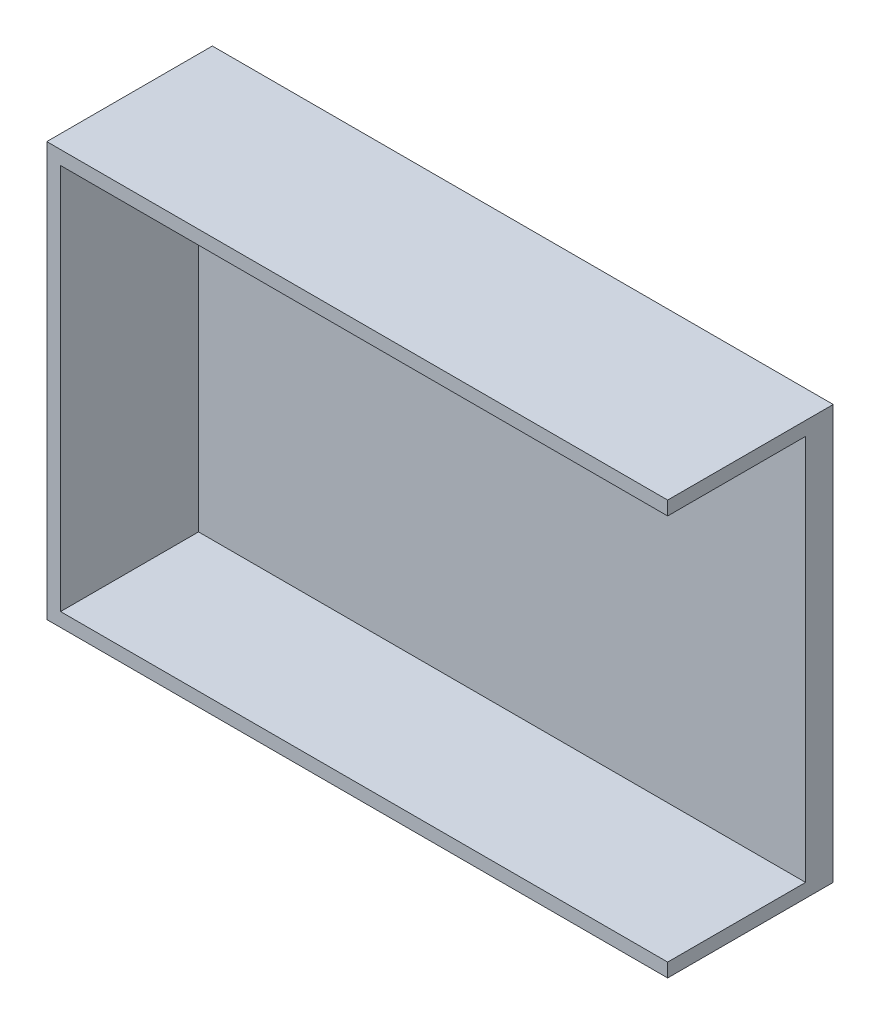
ISO-10303-21;
HEADER;
FILE_DESCRIPTION(('STEP AP214'),'2;1');
FILE_NAME('part.step','',(''),(''),'','','');
FILE_SCHEMA(('AUTOMOTIVE_DESIGN { 1 0 10303 214 1 1 1 1 }'));
ENDSEC;
DATA;
#1=APPLICATION_CONTEXT('core data for automotive mechanical design processes');
#2=APPLICATION_PROTOCOL_DEFINITION('international standard','automotive_design',2000,#1);
#3=PRODUCT_CONTEXT('',#1,'mechanical');
#4=PRODUCT('Part','Part','',(#3));
#5=PRODUCT_RELATED_PRODUCT_CATEGORY('part','',(#4));
#6=PRODUCT_DEFINITION_FORMATION('','',#4);
#7=PRODUCT_DEFINITION_CONTEXT('part definition',#1,'design');
#8=PRODUCT_DEFINITION('design','',#6,#7);
#9=PRODUCT_DEFINITION_SHAPE('','',#8);
#10=(LENGTH_UNIT() NAMED_UNIT(*) SI_UNIT(.MILLI.,.METRE.));
#11=(NAMED_UNIT(*) PLANE_ANGLE_UNIT() SI_UNIT($,.RADIAN.));
#12=(NAMED_UNIT(*) SI_UNIT($,.STERADIAN.) SOLID_ANGLE_UNIT());
#13=UNCERTAINTY_MEASURE_WITH_UNIT(LENGTH_MEASURE(1.E-05),#10,'distance_accuracy_value','');
#14=(GEOMETRIC_REPRESENTATION_CONTEXT(3) GLOBAL_UNCERTAINTY_ASSIGNED_CONTEXT((#13)) GLOBAL_UNIT_ASSIGNED_CONTEXT((#10,
#11,#12)) REPRESENTATION_CONTEXT('',''));
#15=CARTESIAN_POINT('',(0.,0.,0.));
#16=DIRECTION('',(0.,0.,1.));
#17=DIRECTION('',(1.,0.,0.));
#18=AXIS2_PLACEMENT_3D('',#15,#16,#17);
#19=CARTESIAN_POINT('',(0.,0.,12.));
#20=DIRECTION('',(1.,0.,0.));
#21=DIRECTION('',(0.,0.,-1.));
#22=AXIS2_PLACEMENT_3D('',#19,#20,#21);
#23=PLANE('',#22);
#24=DIRECTION('',(0.,-1.,0.));
#25=VECTOR('',#24,1.);
#26=CARTESIAN_POINT('',(0.,0.,0.));
#27=LINE('',#26,#25);
#28=CARTESIAN_POINT('',(0.,30.,0.));
#29=VERTEX_POINT('',#28);
#30=CARTESIAN_POINT('',(0.,0.,0.));
#31=VERTEX_POINT('',#30);
#32=EDGE_CURVE('E136',#29,#31,#27,.T.);
#33=ORIENTED_EDGE('',*,*,#32,.T.);
#34=DIRECTION('',(0.,0.,-1.));
#35=VECTOR('',#34,1.);
#36=CARTESIAN_POINT('',(0.,0.,12.));
#37=LINE('',#36,#35);
#38=CARTESIAN_POINT('',(0.,0.,12.));
#39=VERTEX_POINT('',#38);
#40=EDGE_CURVE('E11',#39,#31,#37,.T.);
#41=ORIENTED_EDGE('',*,*,#40,.F.);
#42=DIRECTION('',(0.,-1.,0.));
#43=VECTOR('',#42,1.);
#44=CARTESIAN_POINT('',(0.,0.,12.));
#45=LINE('',#44,#43);
#46=CARTESIAN_POINT('',(0.,30.,12.));
#47=VERTEX_POINT('',#46);
#48=EDGE_CURVE('E140',#47,#39,#45,.T.);
#49=ORIENTED_EDGE('',*,*,#48,.F.);
#50=DIRECTION('',(0.,0.,-1.));
#51=VECTOR('',#50,1.);
#52=CARTESIAN_POINT('',(0.,30.,12.));
#53=LINE('',#52,#51);
#54=EDGE_CURVE('E148',#47,#29,#53,.T.);
#55=ORIENTED_EDGE('',*,*,#54,.T.);
#56=EDGE_LOOP('',(#33,#41,#49,#55));
#57=FACE_BOUND('',#56,.T.);
#58=ADVANCED_FACE('F32',(#57),#23,.F.);
#59=CARTESIAN_POINT('',(0.,0.,12.));
#60=DIRECTION('',(0.,1.,0.));
#61=DIRECTION('',(0.,0.,1.));
#62=AXIS2_PLACEMENT_3D('',#59,#60,#61);
#63=PLANE('',#62);
#64=DIRECTION('',(1.,0.,0.));
#65=VECTOR('',#64,1.);
#66=CARTESIAN_POINT('',(0.,0.,0.));
#67=LINE('',#66,#65);
#68=CARTESIAN_POINT('',(45.,0.,0.));
#69=VERTEX_POINT('',#68);
#70=EDGE_CURVE('E151',#31,#69,#67,.T.);
#71=ORIENTED_EDGE('',*,*,#70,.T.);
#72=DIRECTION('',(0.,0.,-1.));
#73=VECTOR('',#72,1.);
#74=CARTESIAN_POINT('',(45.,0.,12.));
#75=LINE('',#74,#73);
#76=CARTESIAN_POINT('',(45.,0.,12.));
#77=VERTEX_POINT('',#76);
#78=EDGE_CURVE('E39',#77,#69,#75,.T.);
#79=ORIENTED_EDGE('',*,*,#78,.F.);
#80=DIRECTION('',(1.,0.,0.));
#81=VECTOR('',#80,1.);
#82=CARTESIAN_POINT('',(0.,0.,12.));
#83=LINE('',#82,#81);
#84=EDGE_CURVE('E83',#39,#77,#83,.T.);
#85=ORIENTED_EDGE('',*,*,#84,.F.);
#86=ORIENTED_EDGE('',*,*,#40,.T.);
#87=EDGE_LOOP('',(#71,#79,#85,#86));
#88=FACE_BOUND('',#87,.T.);
#89=ADVANCED_FACE('F187',(#88),#63,.F.);
#90=CARTESIAN_POINT('',(45.,0.,12.));
#91=DIRECTION('',(-1.,0.,0.));
#92=DIRECTION('',(0.,0.,1.));
#93=AXIS2_PLACEMENT_3D('',#90,#91,#92);
#94=PLANE('',#93);
#95=DIRECTION('',(0.,1.,0.));
#96=VECTOR('',#95,1.);
#97=CARTESIAN_POINT('',(45.,0.,12.));
#98=LINE('',#97,#96);
#99=CARTESIAN_POINT('',(45.,29.,12.));
#100=VERTEX_POINT('',#99);
#101=CARTESIAN_POINT('',(45.,30.,12.));
#102=VERTEX_POINT('',#101);
#103=EDGE_CURVE('E143',#100,#102,#98,.T.);
#104=ORIENTED_EDGE('',*,*,#103,.F.);
#105=DIRECTION('',(0.,0.,1.));
#106=VECTOR('',#105,1.);
#107=CARTESIAN_POINT('',(45.,29.,2.));
#108=LINE('',#107,#106);
#109=CARTESIAN_POINT('',(45.,29.,2.));
#110=VERTEX_POINT('',#109);
#111=EDGE_CURVE('E137',#110,#100,#108,.T.);
#112=ORIENTED_EDGE('',*,*,#111,.F.);
#113=DIRECTION('',(0.,1.,0.));
#114=VECTOR('',#113,1.);
#115=CARTESIAN_POINT('',(45.,29.,2.));
#116=LINE('',#115,#114);
#117=CARTESIAN_POINT('',(45.,1.,2.));
#118=VERTEX_POINT('',#117);
#119=EDGE_CURVE('E120',#118,#110,#116,.T.);
#120=ORIENTED_EDGE('',*,*,#119,.F.);
#121=DIRECTION('',(0.,0.,1.));
#122=VECTOR('',#121,1.);
#123=CARTESIAN_POINT('',(45.,1.,2.));
#124=LINE('',#123,#122);
#125=CARTESIAN_POINT('',(45.,1.,12.));
#126=VERTEX_POINT('',#125);
#127=EDGE_CURVE('E111',#118,#126,#124,.T.);
#128=ORIENTED_EDGE('',*,*,#127,.T.);
#129=EDGE_CURVE('E144',#77,#126,#98,.T.);
#130=ORIENTED_EDGE('',*,*,#129,.F.);
#131=ORIENTED_EDGE('',*,*,#78,.T.);
#132=DIRECTION('',(0.,1.,0.));
#133=VECTOR('',#132,1.);
#134=CARTESIAN_POINT('',(45.,0.,0.));
#135=LINE('',#134,#133);
#136=CARTESIAN_POINT('',(45.,30.,0.));
#137=VERTEX_POINT('',#136);
#138=EDGE_CURVE('E153',#69,#137,#135,.T.);
#139=ORIENTED_EDGE('',*,*,#138,.T.);
#140=DIRECTION('',(0.,0.,-1.));
#141=VECTOR('',#140,1.);
#142=CARTESIAN_POINT('',(45.,30.,12.));
#143=LINE('',#142,#141);
#144=EDGE_CURVE('E157',#102,#137,#143,.T.);
#145=ORIENTED_EDGE('',*,*,#144,.F.);
#146=EDGE_LOOP('',(#104,#112,#120,#128,#130,#131,#139,#145));
#147=FACE_BOUND('',#146,.T.);
#148=ADVANCED_FACE('F163',(#147),#94,.F.);
#149=CARTESIAN_POINT('',(0.,30.,12.));
#150=DIRECTION('',(0.,-1.,0.));
#151=DIRECTION('',(0.,0.,-1.));
#152=AXIS2_PLACEMENT_3D('',#149,#150,#151);
#153=PLANE('',#152);
#154=DIRECTION('',(-1.,0.,0.));
#155=VECTOR('',#154,1.);
#156=CARTESIAN_POINT('',(0.,30.,0.));
#157=LINE('',#156,#155);
#158=EDGE_CURVE('E76',#137,#29,#157,.T.);
#159=ORIENTED_EDGE('',*,*,#158,.T.);
#160=ORIENTED_EDGE('',*,*,#54,.F.);
#161=DIRECTION('',(-1.,0.,0.));
#162=VECTOR('',#161,1.);
#163=CARTESIAN_POINT('',(0.,30.,12.));
#164=LINE('',#163,#162);
#165=EDGE_CURVE('E55',#102,#47,#164,.T.);
#166=ORIENTED_EDGE('',*,*,#165,.F.);
#167=ORIENTED_EDGE('',*,*,#144,.T.);
#168=EDGE_LOOP('',(#159,#160,#166,#167));
#169=FACE_BOUND('',#168,.T.);
#170=ADVANCED_FACE('F171',(#169),#153,.F.);
#171=CARTESIAN_POINT('',(0.,0.,12.));
#172=DIRECTION('',(0.,0.,-1.));
#173=DIRECTION('',(-1.,0.,0.));
#174=AXIS2_PLACEMENT_3D('',#171,#172,#173);
#175=PLANE('',#174);
#176=DIRECTION('',(0.,-1.,0.));
#177=VECTOR('',#176,1.);
#178=CARTESIAN_POINT('',(1.,29.,12.));
#179=LINE('',#178,#177);
#180=CARTESIAN_POINT('',(1.,29.,12.));
#181=VERTEX_POINT('',#180);
#182=CARTESIAN_POINT('',(1.,1.,12.));
#183=VERTEX_POINT('',#182);
#184=EDGE_CURVE('E46',#181,#183,#179,.T.);
#185=ORIENTED_EDGE('',*,*,#184,.F.);
#186=DIRECTION('',(-1.,0.,0.));
#187=VECTOR('',#186,1.);
#188=CARTESIAN_POINT('',(1.,29.,12.));
#189=LINE('',#188,#187);
#190=EDGE_CURVE('E124',#100,#181,#189,.T.);
#191=ORIENTED_EDGE('',*,*,#190,.F.);
#192=ORIENTED_EDGE('',*,*,#103,.T.);
#193=ORIENTED_EDGE('',*,*,#165,.T.);
#194=ORIENTED_EDGE('',*,*,#48,.T.);
#195=ORIENTED_EDGE('',*,*,#84,.T.);
#196=ORIENTED_EDGE('',*,*,#129,.T.);
#197=DIRECTION('',(1.,0.,0.));
#198=VECTOR('',#197,1.);
#199=CARTESIAN_POINT('',(1.,1.,12.));
#200=LINE('',#199,#198);
#201=EDGE_CURVE('E127',#183,#126,#200,.T.);
#202=ORIENTED_EDGE('',*,*,#201,.F.);
#203=EDGE_LOOP('',(#185,#191,#192,#193,#194,#195,#196,#202));
#204=FACE_BOUND('',#203,.T.);
#205=ADVANCED_FACE('F174',(#204),#175,.F.);
#206=CARTESIAN_POINT('',(0.,0.,0.));
#207=DIRECTION('',(0.,0.,-1.));
#208=DIRECTION('',(-1.,0.,0.));
#209=AXIS2_PLACEMENT_3D('',#206,#207,#208);
#210=PLANE('',#209);
#211=ORIENTED_EDGE('',*,*,#32,.F.);
#212=ORIENTED_EDGE('',*,*,#158,.F.);
#213=ORIENTED_EDGE('',*,*,#138,.F.);
#214=ORIENTED_EDGE('',*,*,#70,.F.);
#215=EDGE_LOOP('',(#211,#212,#213,#214));
#216=FACE_BOUND('',#215,.T.);
#217=ADVANCED_FACE('F167',(#216),#210,.T.);
#218=CARTESIAN_POINT('',(1.,29.,2.));
#219=DIRECTION('',(-1.,0.,0.));
#220=DIRECTION('',(0.,-1.,0.));
#221=AXIS2_PLACEMENT_3D('',#218,#219,#220);
#222=PLANE('',#221);
#223=ORIENTED_EDGE('',*,*,#184,.T.);
#224=DIRECTION('',(0.,0.,1.));
#225=VECTOR('',#224,1.);
#226=CARTESIAN_POINT('',(1.,1.,2.));
#227=LINE('',#226,#225);
#228=CARTESIAN_POINT('',(1.,1.,2.));
#229=VERTEX_POINT('',#228);
#230=EDGE_CURVE('E103',#229,#183,#227,.T.);
#231=ORIENTED_EDGE('',*,*,#230,.F.);
#232=DIRECTION('',(0.,-1.,0.));
#233=VECTOR('',#232,1.);
#234=CARTESIAN_POINT('',(1.,29.,2.));
#235=LINE('',#234,#233);
#236=CARTESIAN_POINT('',(1.,29.,2.));
#237=VERTEX_POINT('',#236);
#238=EDGE_CURVE('E107',#237,#229,#235,.T.);
#239=ORIENTED_EDGE('',*,*,#238,.F.);
#240=DIRECTION('',(0.,0.,1.));
#241=VECTOR('',#240,1.);
#242=CARTESIAN_POINT('',(1.,29.,2.));
#243=LINE('',#242,#241);
#244=EDGE_CURVE('E134',#237,#181,#243,.T.);
#245=ORIENTED_EDGE('',*,*,#244,.T.);
#246=EDGE_LOOP('',(#223,#231,#239,#245));
#247=FACE_BOUND('',#246,.T.);
#248=ADVANCED_FACE('F105',(#247),#222,.F.);
#249=CARTESIAN_POINT('',(1.,29.,2.));
#250=DIRECTION('',(0.,1.,0.));
#251=DIRECTION('',(0.,0.,1.));
#252=AXIS2_PLACEMENT_3D('',#249,#250,#251);
#253=PLANE('',#252);
#254=ORIENTED_EDGE('',*,*,#190,.T.);
#255=ORIENTED_EDGE('',*,*,#244,.F.);
#256=DIRECTION('',(-1.,0.,0.));
#257=VECTOR('',#256,1.);
#258=CARTESIAN_POINT('',(1.,29.,2.));
#259=LINE('',#258,#257);
#260=EDGE_CURVE('E112',#110,#237,#259,.T.);
#261=ORIENTED_EDGE('',*,*,#260,.F.);
#262=ORIENTED_EDGE('',*,*,#111,.T.);
#263=EDGE_LOOP('',(#254,#255,#261,#262));
#264=FACE_BOUND('',#263,.T.);
#265=ADVANCED_FACE('F176',(#264),#253,.F.);
#266=CARTESIAN_POINT('',(1.,1.,2.));
#267=DIRECTION('',(0.,-1.,0.));
#268=DIRECTION('',(0.,0.,-1.));
#269=AXIS2_PLACEMENT_3D('',#266,#267,#268);
#270=PLANE('',#269);
#271=ORIENTED_EDGE('',*,*,#201,.T.);
#272=ORIENTED_EDGE('',*,*,#127,.F.);
#273=DIRECTION('',(1.,0.,0.));
#274=VECTOR('',#273,1.);
#275=CARTESIAN_POINT('',(1.,1.,2.));
#276=LINE('',#275,#274);
#277=EDGE_CURVE('E115',#229,#118,#276,.T.);
#278=ORIENTED_EDGE('',*,*,#277,.F.);
#279=ORIENTED_EDGE('',*,*,#230,.T.);
#280=EDGE_LOOP('',(#271,#272,#278,#279));
#281=FACE_BOUND('',#280,.T.);
#282=ADVANCED_FACE('F116',(#281),#270,.F.);
#283=CARTESIAN_POINT('',(0.,0.,2.));
#284=DIRECTION('',(0.,0.,1.));
#285=DIRECTION('',(1.,0.,0.));
#286=AXIS2_PLACEMENT_3D('',#283,#284,#285);
#287=PLANE('',#286);
#288=ORIENTED_EDGE('',*,*,#238,.T.);
#289=ORIENTED_EDGE('',*,*,#277,.T.);
#290=ORIENTED_EDGE('',*,*,#119,.T.);
#291=ORIENTED_EDGE('',*,*,#260,.T.);
#292=EDGE_LOOP('',(#288,#289,#290,#291));
#293=FACE_BOUND('',#292,.T.);
#294=ADVANCED_FACE('F122',(#293),#287,.T.);
#295=CLOSED_SHELL('',(#58,#89,#148,#170,#205,#217,#248,#265,#282,#294));
#296=MANIFOLD_SOLID_BREP('B2',#295);
#297=ADVANCED_BREP_SHAPE_REPRESENTATION('',(#18,#296),#14);
#298=SHAPE_DEFINITION_REPRESENTATION(#9,#297);
ENDSEC;
END-ISO-10303-21;
